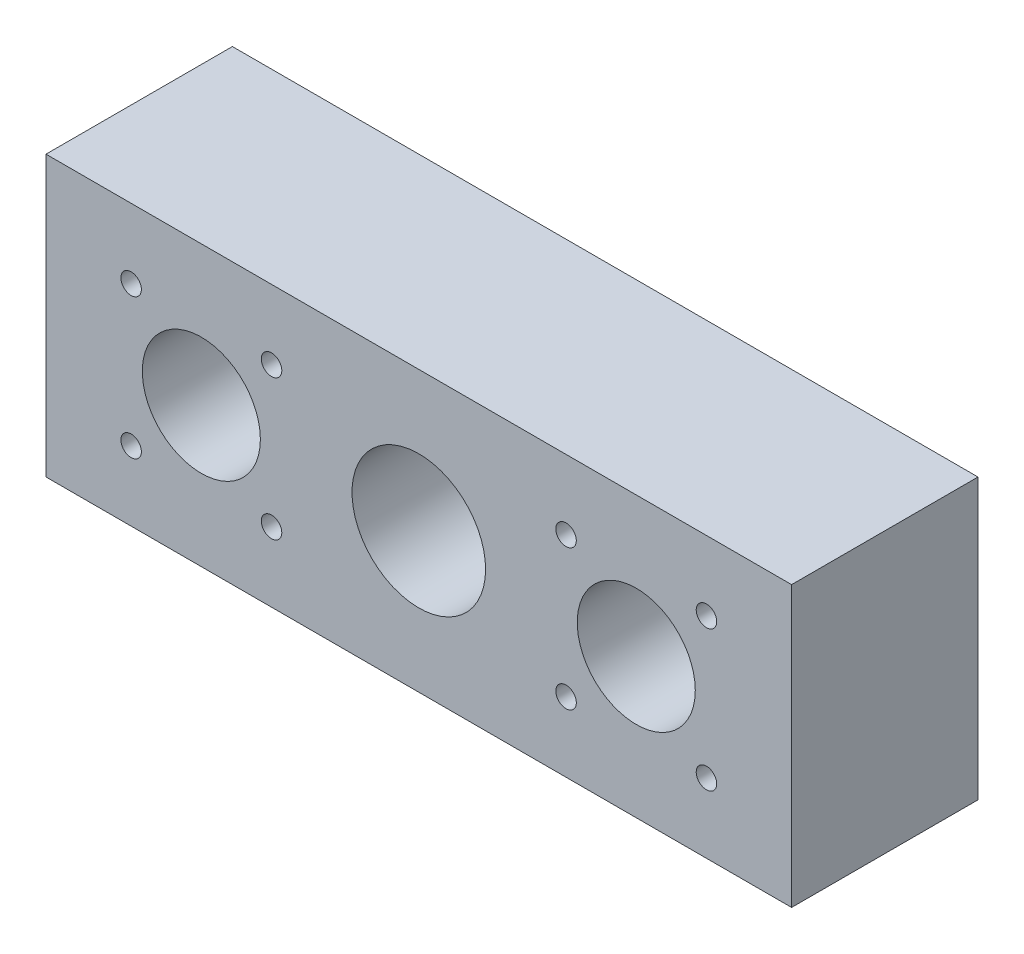
ISO-10303-21;
HEADER;
FILE_DESCRIPTION(('STEP AP214'),'2;1');
FILE_NAME('part.step','',(''),(''),'','','');
FILE_SCHEMA(('AUTOMOTIVE_DESIGN { 1 0 10303 214 1 1 1 1 }'));
ENDSEC;
DATA;
#1=APPLICATION_CONTEXT('core data for automotive mechanical design processes');
#2=APPLICATION_PROTOCOL_DEFINITION('international standard','automotive_design',2000,#1);
#3=PRODUCT_CONTEXT('',#1,'mechanical');
#4=PRODUCT('Part','Part','',(#3));
#5=PRODUCT_RELATED_PRODUCT_CATEGORY('part','',(#4));
#6=PRODUCT_DEFINITION_FORMATION('','',#4);
#7=PRODUCT_DEFINITION_CONTEXT('part definition',#1,'design');
#8=PRODUCT_DEFINITION('design','',#6,#7);
#9=PRODUCT_DEFINITION_SHAPE('','',#8);
#10=(LENGTH_UNIT() NAMED_UNIT(*) SI_UNIT(.MILLI.,.METRE.));
#11=(NAMED_UNIT(*) PLANE_ANGLE_UNIT() SI_UNIT($,.RADIAN.));
#12=(NAMED_UNIT(*) SI_UNIT($,.STERADIAN.) SOLID_ANGLE_UNIT());
#13=UNCERTAINTY_MEASURE_WITH_UNIT(LENGTH_MEASURE(1.E-05),#10,'distance_accuracy_value','');
#14=(GEOMETRIC_REPRESENTATION_CONTEXT(3) GLOBAL_UNCERTAINTY_ASSIGNED_CONTEXT((#13)) GLOBAL_UNIT_ASSIGNED_CONTEXT((#10,
#11,#12)) REPRESENTATION_CONTEXT('',''));
#15=CARTESIAN_POINT('',(0.,0.,0.));
#16=DIRECTION('',(0.,0.,1.));
#17=DIRECTION('',(1.,0.,0.));
#18=AXIS2_PLACEMENT_3D('',#15,#16,#17);
#19=CARTESIAN_POINT('',(60.,-22.5,30.));
#20=DIRECTION('',(-1.,0.,0.));
#21=DIRECTION('',(0.,0.,1.));
#22=AXIS2_PLACEMENT_3D('',#19,#20,#21);
#23=PLANE('',#22);
#24=DIRECTION('',(0.,1.,0.));
#25=VECTOR('',#24,1.);
#26=CARTESIAN_POINT('',(60.,-22.5,0.));
#27=LINE('',#26,#25);
#28=CARTESIAN_POINT('',(60.,-22.5,0.));
#29=VERTEX_POINT('',#28);
#30=CARTESIAN_POINT('',(60.,22.5,0.));
#31=VERTEX_POINT('',#30);
#32=EDGE_CURVE('E291',#29,#31,#27,.T.);
#33=ORIENTED_EDGE('',*,*,#32,.T.);
#34=DIRECTION('',(0.,0.,-1.));
#35=VECTOR('',#34,1.);
#36=CARTESIAN_POINT('',(60.,22.5,30.));
#37=LINE('',#36,#35);
#38=CARTESIAN_POINT('',(60.,22.5,30.));
#39=VERTEX_POINT('',#38);
#40=EDGE_CURVE('E11',#39,#31,#37,.T.);
#41=ORIENTED_EDGE('',*,*,#40,.F.);
#42=DIRECTION('',(0.,1.,0.));
#43=VECTOR('',#42,1.);
#44=CARTESIAN_POINT('',(60.,-22.5,30.));
#45=LINE('',#44,#43);
#46=CARTESIAN_POINT('',(60.,-22.5,30.));
#47=VERTEX_POINT('',#46);
#48=EDGE_CURVE('E294',#47,#39,#45,.T.);
#49=ORIENTED_EDGE('',*,*,#48,.F.);
#50=DIRECTION('',(0.,0.,-1.));
#51=VECTOR('',#50,1.);
#52=CARTESIAN_POINT('',(60.,-22.5,30.));
#53=LINE('',#52,#51);
#54=EDGE_CURVE('E300',#47,#29,#53,.T.);
#55=ORIENTED_EDGE('',*,*,#54,.T.);
#56=EDGE_LOOP('',(#33,#41,#49,#55));
#57=FACE_BOUND('',#56,.T.);
#58=ADVANCED_FACE('F38',(#57),#23,.F.);
#59=CARTESIAN_POINT('',(-60.,22.5,30.));
#60=DIRECTION('',(0.,-1.,0.));
#61=DIRECTION('',(0.,0.,-1.));
#62=AXIS2_PLACEMENT_3D('',#59,#60,#61);
#63=PLANE('',#62);
#64=DIRECTION('',(-1.,0.,0.));
#65=VECTOR('',#64,1.);
#66=CARTESIAN_POINT('',(-60.,22.5,0.));
#67=LINE('',#66,#65);
#68=CARTESIAN_POINT('',(-60.,22.5,0.));
#69=VERTEX_POINT('',#68);
#70=EDGE_CURVE('E303',#31,#69,#67,.T.);
#71=ORIENTED_EDGE('',*,*,#70,.T.);
#72=DIRECTION('',(0.,0.,-1.));
#73=VECTOR('',#72,1.);
#74=CARTESIAN_POINT('',(-60.,22.5,30.));
#75=LINE('',#74,#73);
#76=CARTESIAN_POINT('',(-60.,22.5,30.));
#77=VERTEX_POINT('',#76);
#78=EDGE_CURVE('E46',#77,#69,#75,.T.);
#79=ORIENTED_EDGE('',*,*,#78,.F.);
#80=DIRECTION('',(-1.,0.,0.));
#81=VECTOR('',#80,1.);
#82=CARTESIAN_POINT('',(-60.,22.5,30.));
#83=LINE('',#82,#81);
#84=EDGE_CURVE('E85',#39,#77,#83,.T.);
#85=ORIENTED_EDGE('',*,*,#84,.F.);
#86=ORIENTED_EDGE('',*,*,#40,.T.);
#87=EDGE_LOOP('',(#71,#79,#85,#86));
#88=FACE_BOUND('',#87,.T.);
#89=ADVANCED_FACE('F328',(#88),#63,.F.);
#90=CARTESIAN_POINT('',(-60.,-22.5,30.));
#91=DIRECTION('',(1.,0.,0.));
#92=DIRECTION('',(0.,0.,-1.));
#93=AXIS2_PLACEMENT_3D('',#90,#91,#92);
#94=PLANE('',#93);
#95=DIRECTION('',(0.,-1.,0.));
#96=VECTOR('',#95,1.);
#97=CARTESIAN_POINT('',(-60.,-22.5,0.));
#98=LINE('',#97,#96);
#99=CARTESIAN_POINT('',(-60.,-22.5,0.));
#100=VERTEX_POINT('',#99);
#101=EDGE_CURVE('E72',#69,#100,#98,.T.);
#102=ORIENTED_EDGE('',*,*,#101,.T.);
#103=DIRECTION('',(0.,0.,-1.));
#104=VECTOR('',#103,1.);
#105=CARTESIAN_POINT('',(-60.,-22.5,30.));
#106=LINE('',#105,#104);
#107=CARTESIAN_POINT('',(-60.,-22.5,30.));
#108=VERTEX_POINT('',#107);
#109=EDGE_CURVE('E308',#108,#100,#106,.T.);
#110=ORIENTED_EDGE('',*,*,#109,.F.);
#111=DIRECTION('',(0.,-1.,0.));
#112=VECTOR('',#111,1.);
#113=CARTESIAN_POINT('',(-60.,-22.5,30.));
#114=LINE('',#113,#112);
#115=EDGE_CURVE('E297',#77,#108,#114,.T.);
#116=ORIENTED_EDGE('',*,*,#115,.F.);
#117=ORIENTED_EDGE('',*,*,#78,.T.);
#118=EDGE_LOOP('',(#102,#110,#116,#117));
#119=FACE_BOUND('',#118,.T.);
#120=ADVANCED_FACE('F310',(#119),#94,.F.);
#121=CARTESIAN_POINT('',(-60.,-22.5,30.));
#122=DIRECTION('',(0.,1.,0.));
#123=DIRECTION('',(0.,0.,1.));
#124=AXIS2_PLACEMENT_3D('',#121,#122,#123);
#125=PLANE('',#124);
#126=CARTESIAN_POINT('',(40.6066017177982,-22.5,4.39339828220176));
#127=DIRECTION('',(0.,-1.,0.));
#128=DIRECTION('',(0.,0.,-1.));
#129=AXIS2_PLACEMENT_3D('',#126,#127,#128);
#130=CIRCLE('',#129,1.24999999999999);
#131=CARTESIAN_POINT('',(40.6066017177982,-22.5,3.14339828220177));
#132=VERTEX_POINT('',#131);
#133=EDGE_CURVE('E157',#132,#132,#130,.T.);
#134=ORIENTED_EDGE('',*,*,#133,.F.);
#135=EDGE_LOOP('',(#134));
#136=FACE_BOUND('',#135,.T.);
#137=CARTESIAN_POINT('',(19.3933982822018,-22.5,4.39339828220177));
#138=DIRECTION('',(0.,-1.,0.));
#139=DIRECTION('',(0.,0.,-1.));
#140=AXIS2_PLACEMENT_3D('',#137,#138,#139);
#141=CIRCLE('',#140,1.24999999999999);
#142=CARTESIAN_POINT('',(19.3933982822018,-22.5,3.14339828220179));
#143=VERTEX_POINT('',#142);
#144=EDGE_CURVE('E156',#143,#143,#141,.T.);
#145=ORIENTED_EDGE('',*,*,#144,.F.);
#146=EDGE_LOOP('',(#145));
#147=FACE_BOUND('',#146,.T.);
#148=CARTESIAN_POINT('',(19.3933982822018,-22.5,25.6066017177982));
#149=DIRECTION('',(0.,-1.,0.));
#150=DIRECTION('',(0.,0.,-1.));
#151=AXIS2_PLACEMENT_3D('',#148,#149,#150);
#152=CIRCLE('',#151,1.24999999999999);
#153=CARTESIAN_POINT('',(19.3933982822018,-22.5,24.3566017177982));
#154=VERTEX_POINT('',#153);
#155=EDGE_CURVE('E167',#154,#154,#152,.T.);
#156=ORIENTED_EDGE('',*,*,#155,.F.);
#157=EDGE_LOOP('',(#156));
#158=FACE_BOUND('',#157,.T.);
#159=CARTESIAN_POINT('',(40.6066017177982,-22.5,25.6066017177982));
#160=DIRECTION('',(0.,-1.,0.));
#161=DIRECTION('',(0.,0.,-1.));
#162=AXIS2_PLACEMENT_3D('',#159,#160,#161);
#163=CIRCLE('',#162,1.24999999999999);
#164=CARTESIAN_POINT('',(40.6066017177982,-22.5,24.3566017177982));
#165=VERTEX_POINT('',#164);
#166=EDGE_CURVE('E173',#165,#165,#163,.T.);
#167=ORIENTED_EDGE('',*,*,#166,.F.);
#168=EDGE_LOOP('',(#167));
#169=FACE_BOUND('',#168,.T.);
#170=CARTESIAN_POINT('',(-19.3933982822018,-22.5,4.39339828220179));
#171=DIRECTION('',(0.,-1.,0.));
#172=DIRECTION('',(0.,0.,-1.));
#173=AXIS2_PLACEMENT_3D('',#170,#171,#172);
#174=CIRCLE('',#173,1.24999999999999);
#175=CARTESIAN_POINT('',(-19.3933982822018,-22.5,3.14339828220181));
#176=VERTEX_POINT('',#175);
#177=EDGE_CURVE('E179',#176,#176,#174,.T.);
#178=ORIENTED_EDGE('',*,*,#177,.F.);
#179=EDGE_LOOP('',(#178));
#180=FACE_BOUND('',#179,.T.);
#181=CARTESIAN_POINT('',(-40.6066017177982,-22.5,4.39339828220179));
#182=DIRECTION('',(0.,-1.,0.));
#183=DIRECTION('',(0.,0.,-1.));
#184=AXIS2_PLACEMENT_3D('',#181,#182,#183);
#185=CIRCLE('',#184,1.24999999999999);
#186=CARTESIAN_POINT('',(-40.6066017177982,-22.5,3.14339828220181));
#187=VERTEX_POINT('',#186);
#188=EDGE_CURVE('E185',#187,#187,#185,.T.);
#189=ORIENTED_EDGE('',*,*,#188,.F.);
#190=EDGE_LOOP('',(#189));
#191=FACE_BOUND('',#190,.T.);
#192=CARTESIAN_POINT('',(-19.3933982822018,-22.5,25.6066017177982));
#193=DIRECTION('',(0.,-1.,0.));
#194=DIRECTION('',(0.,0.,-1.));
#195=AXIS2_PLACEMENT_3D('',#192,#193,#194);
#196=CIRCLE('',#195,1.24999999999999);
#197=CARTESIAN_POINT('',(-19.3933982822018,-22.5,24.3566017177982));
#198=VERTEX_POINT('',#197);
#199=EDGE_CURVE('E191',#198,#198,#196,.T.);
#200=ORIENTED_EDGE('',*,*,#199,.F.);
#201=EDGE_LOOP('',(#200));
#202=FACE_BOUND('',#201,.T.);
#203=CARTESIAN_POINT('',(-40.6066017177982,-22.5,25.6066017177982));
#204=DIRECTION('',(0.,-1.,0.));
#205=DIRECTION('',(0.,0.,-1.));
#206=AXIS2_PLACEMENT_3D('',#203,#204,#205);
#207=CIRCLE('',#206,1.24999999999999);
#208=CARTESIAN_POINT('',(-40.6066017177982,-22.5,24.3566017177982));
#209=VERTEX_POINT('',#208);
#210=EDGE_CURVE('E197',#209,#209,#207,.T.);
#211=ORIENTED_EDGE('',*,*,#210,.F.);
#212=EDGE_LOOP('',(#211));
#213=FACE_BOUND('',#212,.T.);
#214=DIRECTION('',(1.,0.,0.));
#215=VECTOR('',#214,1.);
#216=CARTESIAN_POINT('',(-60.,-22.5,0.));
#217=LINE('',#216,#215);
#218=EDGE_CURVE('E78',#100,#29,#217,.T.);
#219=ORIENTED_EDGE('',*,*,#218,.T.);
#220=ORIENTED_EDGE('',*,*,#54,.F.);
#221=DIRECTION('',(1.,0.,0.));
#222=VECTOR('',#221,1.);
#223=CARTESIAN_POINT('',(-60.,-22.5,30.));
#224=LINE('',#223,#222);
#225=EDGE_CURVE('E54',#108,#47,#224,.T.);
#226=ORIENTED_EDGE('',*,*,#225,.F.);
#227=ORIENTED_EDGE('',*,*,#109,.T.);
#228=EDGE_LOOP('',(#219,#220,#226,#227));
#229=FACE_BOUND('',#228,.T.);
#230=ADVANCED_FACE('F317',(#136,#147,#158,#169,#180,#191,#202,#213,#229),#125,.F.);
#231=CARTESIAN_POINT('',(0.,0.,30.));
#232=DIRECTION('',(0.,0.,-1.));
#233=DIRECTION('',(-1.,0.,0.));
#234=AXIS2_PLACEMENT_3D('',#231,#232,#233);
#235=PLANE('',#234);
#236=CARTESIAN_POINT('',(-23.7,11.3,30.));
#237=DIRECTION('',(0.,0.,1.));
#238=DIRECTION('',(1.,0.,0.));
#239=AXIS2_PLACEMENT_3D('',#236,#237,#238);
#240=CIRCLE('',#239,1.65);
#241=CARTESIAN_POINT('',(-22.05,11.3,30.));
#242=VERTEX_POINT('',#241);
#243=EDGE_CURVE('E227',#242,#242,#240,.T.);
#244=ORIENTED_EDGE('',*,*,#243,.F.);
#245=EDGE_LOOP('',(#244));
#246=FACE_BOUND('',#245,.T.);
#247=CARTESIAN_POINT('',(-46.3,-11.3,30.));
#248=DIRECTION('',(0.,0.,1.));
#249=DIRECTION('',(1.,0.,0.));
#250=AXIS2_PLACEMENT_3D('',#247,#248,#249);
#251=CIRCLE('',#250,1.65);
#252=CARTESIAN_POINT('',(-44.65,-11.3,30.));
#253=VERTEX_POINT('',#252);
#254=EDGE_CURVE('E233',#253,#253,#251,.T.);
#255=ORIENTED_EDGE('',*,*,#254,.F.);
#256=EDGE_LOOP('',(#255));
#257=FACE_BOUND('',#256,.T.);
#258=CARTESIAN_POINT('',(-46.3,11.3,30.));
#259=DIRECTION('',(0.,0.,1.));
#260=DIRECTION('',(1.,0.,0.));
#261=AXIS2_PLACEMENT_3D('',#258,#259,#260);
#262=CIRCLE('',#261,1.65);
#263=CARTESIAN_POINT('',(-44.65,11.3,30.));
#264=VERTEX_POINT('',#263);
#265=EDGE_CURVE('E239',#264,#264,#262,.T.);
#266=ORIENTED_EDGE('',*,*,#265,.F.);
#267=EDGE_LOOP('',(#266));
#268=FACE_BOUND('',#267,.T.);
#269=CARTESIAN_POINT('',(-23.7,-11.3,30.));
#270=DIRECTION('',(0.,0.,1.));
#271=DIRECTION('',(1.,0.,0.));
#272=AXIS2_PLACEMENT_3D('',#269,#270,#271);
#273=CIRCLE('',#272,1.65);
#274=CARTESIAN_POINT('',(-22.05,-11.3,30.));
#275=VERTEX_POINT('',#274);
#276=EDGE_CURVE('E245',#275,#275,#273,.T.);
#277=ORIENTED_EDGE('',*,*,#276,.F.);
#278=EDGE_LOOP('',(#277));
#279=FACE_BOUND('',#278,.T.);
#280=CARTESIAN_POINT('',(46.3,11.3,30.));
#281=DIRECTION('',(0.,0.,1.));
#282=DIRECTION('',(1.,0.,0.));
#283=AXIS2_PLACEMENT_3D('',#280,#281,#282);
#284=CIRCLE('',#283,1.65);
#285=CARTESIAN_POINT('',(47.95,11.3,30.));
#286=VERTEX_POINT('',#285);
#287=EDGE_CURVE('E251',#286,#286,#284,.T.);
#288=ORIENTED_EDGE('',*,*,#287,.F.);
#289=EDGE_LOOP('',(#288));
#290=FACE_BOUND('',#289,.T.);
#291=CARTESIAN_POINT('',(46.3,-11.3,30.));
#292=DIRECTION('',(0.,0.,1.));
#293=DIRECTION('',(1.,0.,0.));
#294=AXIS2_PLACEMENT_3D('',#291,#292,#293);
#295=CIRCLE('',#294,1.65);
#296=CARTESIAN_POINT('',(47.95,-11.3,30.));
#297=VERTEX_POINT('',#296);
#298=EDGE_CURVE('E257',#297,#297,#295,.T.);
#299=ORIENTED_EDGE('',*,*,#298,.F.);
#300=EDGE_LOOP('',(#299));
#301=FACE_BOUND('',#300,.T.);
#302=CARTESIAN_POINT('',(23.7,-11.3,30.));
#303=DIRECTION('',(0.,0.,1.));
#304=DIRECTION('',(1.,0.,0.));
#305=AXIS2_PLACEMENT_3D('',#302,#303,#304);
#306=CIRCLE('',#305,1.65);
#307=CARTESIAN_POINT('',(25.35,-11.3,30.));
#308=VERTEX_POINT('',#307);
#309=EDGE_CURVE('E263',#308,#308,#306,.T.);
#310=ORIENTED_EDGE('',*,*,#309,.F.);
#311=EDGE_LOOP('',(#310));
#312=FACE_BOUND('',#311,.T.);
#313=CARTESIAN_POINT('',(23.7,11.3,30.));
#314=DIRECTION('',(0.,0.,1.));
#315=DIRECTION('',(1.,0.,0.));
#316=AXIS2_PLACEMENT_3D('',#313,#314,#315);
#317=CIRCLE('',#316,1.65);
#318=CARTESIAN_POINT('',(25.35,11.3,30.));
#319=VERTEX_POINT('',#318);
#320=EDGE_CURVE('E269',#319,#319,#317,.T.);
#321=ORIENTED_EDGE('',*,*,#320,.F.);
#322=EDGE_LOOP('',(#321));
#323=FACE_BOUND('',#322,.T.);
#324=CARTESIAN_POINT('',(0.,0.,30.));
#325=DIRECTION('',(0.,0.,1.));
#326=DIRECTION('',(1.,0.,0.));
#327=AXIS2_PLACEMENT_3D('',#324,#325,#326);
#328=CIRCLE('',#327,10.75);
#329=CARTESIAN_POINT('',(10.75,0.,30.));
#330=VERTEX_POINT('',#329);
#331=EDGE_CURVE('E276',#330,#330,#328,.T.);
#332=ORIENTED_EDGE('',*,*,#331,.F.);
#333=EDGE_LOOP('',(#332));
#334=FACE_BOUND('',#333,.T.);
#335=CARTESIAN_POINT('',(35.,0.,30.));
#336=DIRECTION('',(0.,0.,1.));
#337=DIRECTION('',(1.,0.,0.));
#338=AXIS2_PLACEMENT_3D('',#335,#336,#337);
#339=CIRCLE('',#338,9.5);
#340=CARTESIAN_POINT('',(44.5,0.,30.));
#341=VERTEX_POINT('',#340);
#342=EDGE_CURVE('E282',#341,#341,#339,.T.);
#343=ORIENTED_EDGE('',*,*,#342,.F.);
#344=EDGE_LOOP('',(#343));
#345=FACE_BOUND('',#344,.T.);
#346=CARTESIAN_POINT('',(-35.,0.,30.));
#347=DIRECTION('',(0.,0.,1.));
#348=DIRECTION('',(1.,0.,0.));
#349=AXIS2_PLACEMENT_3D('',#346,#347,#348);
#350=CIRCLE('',#349,9.5);
#351=CARTESIAN_POINT('',(-25.5,0.,30.));
#352=VERTEX_POINT('',#351);
#353=EDGE_CURVE('E288',#352,#352,#350,.T.);
#354=ORIENTED_EDGE('',*,*,#353,.F.);
#355=EDGE_LOOP('',(#354));
#356=FACE_BOUND('',#355,.T.);
#357=ORIENTED_EDGE('',*,*,#48,.T.);
#358=ORIENTED_EDGE('',*,*,#84,.T.);
#359=ORIENTED_EDGE('',*,*,#115,.T.);
#360=ORIENTED_EDGE('',*,*,#225,.T.);
#361=EDGE_LOOP('',(#357,#358,#359,#360));
#362=FACE_BOUND('',#361,.T.);
#363=ADVANCED_FACE('F319',(#246,#257,#268,#279,#290,#301,#312,#323,#334,#345,#356,#362),#235,.F.);
#364=CARTESIAN_POINT('',(0.,0.,0.));
#365=DIRECTION('',(0.,0.,-1.));
#366=DIRECTION('',(-1.,0.,0.));
#367=AXIS2_PLACEMENT_3D('',#364,#365,#366);
#368=PLANE('',#367);
#369=CARTESIAN_POINT('',(-11.3137084989847,11.3137084989848,0.));
#370=DIRECTION('',(0.,0.,-1.));
#371=DIRECTION('',(-1.,0.,0.));
#372=AXIS2_PLACEMENT_3D('',#369,#370,#371);
#373=CIRCLE('',#372,1.64999999999999);
#374=CARTESIAN_POINT('',(-12.9637084989847,11.3137084989848,0.));
#375=VERTEX_POINT('',#374);
#376=EDGE_CURVE('E203',#375,#375,#373,.T.);
#377=ORIENTED_EDGE('',*,*,#376,.F.);
#378=EDGE_LOOP('',(#377));
#379=FACE_BOUND('',#378,.T.);
#380=CARTESIAN_POINT('',(11.3137084989848,-11.3137084989847,0.));
#381=DIRECTION('',(0.,0.,-1.));
#382=DIRECTION('',(-1.,0.,0.));
#383=AXIS2_PLACEMENT_3D('',#380,#381,#382);
#384=CIRCLE('',#383,1.64999999999999);
#385=CARTESIAN_POINT('',(9.66370849898483,-11.3137084989847,0.));
#386=VERTEX_POINT('',#385);
#387=EDGE_CURVE('E209',#386,#386,#384,.T.);
#388=ORIENTED_EDGE('',*,*,#387,.F.);
#389=EDGE_LOOP('',(#388));
#390=FACE_BOUND('',#389,.T.);
#391=CARTESIAN_POINT('',(11.3137084989848,11.3137084989847,0.));
#392=DIRECTION('',(0.,0.,-1.));
#393=DIRECTION('',(-1.,0.,0.));
#394=AXIS2_PLACEMENT_3D('',#391,#392,#393);
#395=CIRCLE('',#394,1.64999999999999);
#396=CARTESIAN_POINT('',(9.66370849898483,11.3137084989847,0.));
#397=VERTEX_POINT('',#396);
#398=EDGE_CURVE('E215',#397,#397,#395,.T.);
#399=ORIENTED_EDGE('',*,*,#398,.F.);
#400=EDGE_LOOP('',(#399));
#401=FACE_BOUND('',#400,.T.);
#402=CARTESIAN_POINT('',(-11.3137084989848,-11.3137084989847,0.));
#403=DIRECTION('',(0.,0.,-1.));
#404=DIRECTION('',(-1.,0.,0.));
#405=AXIS2_PLACEMENT_3D('',#402,#403,#404);
#406=CIRCLE('',#405,1.64999999999999);
#407=CARTESIAN_POINT('',(-12.9637084989848,-11.3137084989847,0.));
#408=VERTEX_POINT('',#407);
#409=EDGE_CURVE('E221',#408,#408,#406,.T.);
#410=ORIENTED_EDGE('',*,*,#409,.F.);
#411=EDGE_LOOP('',(#410));
#412=FACE_BOUND('',#411,.T.);
#413=CARTESIAN_POINT('',(0.,0.,0.));
#414=DIRECTION('',(0.,0.,-1.));
#415=DIRECTION('',(-1.,0.,0.));
#416=AXIS2_PLACEMENT_3D('',#413,#414,#415);
#417=CIRCLE('',#416,10.75);
#418=CARTESIAN_POINT('',(-10.75,0.,0.));
#419=VERTEX_POINT('',#418);
#420=EDGE_CURVE('E275',#419,#419,#417,.F.);
#421=ORIENTED_EDGE('',*,*,#420,.T.);
#422=EDGE_LOOP('',(#421));
#423=FACE_BOUND('',#422,.T.);
#424=CARTESIAN_POINT('',(35.,0.,0.));
#425=DIRECTION('',(0.,0.,-1.));
#426=DIRECTION('',(-1.,0.,0.));
#427=AXIS2_PLACEMENT_3D('',#424,#425,#426);
#428=CIRCLE('',#427,9.5);
#429=CARTESIAN_POINT('',(25.5,0.,0.));
#430=VERTEX_POINT('',#429);
#431=EDGE_CURVE('E279',#430,#430,#428,.F.);
#432=ORIENTED_EDGE('',*,*,#431,.T.);
#433=EDGE_LOOP('',(#432));
#434=FACE_BOUND('',#433,.T.);
#435=CARTESIAN_POINT('',(-35.,0.,0.));
#436=DIRECTION('',(0.,0.,-1.));
#437=DIRECTION('',(-1.,0.,0.));
#438=AXIS2_PLACEMENT_3D('',#435,#436,#437);
#439=CIRCLE('',#438,9.5);
#440=CARTESIAN_POINT('',(-44.5,0.,0.));
#441=VERTEX_POINT('',#440);
#442=EDGE_CURVE('E285',#441,#441,#439,.F.);
#443=ORIENTED_EDGE('',*,*,#442,.T.);
#444=EDGE_LOOP('',(#443));
#445=FACE_BOUND('',#444,.T.);
#446=ORIENTED_EDGE('',*,*,#32,.F.);
#447=ORIENTED_EDGE('',*,*,#218,.F.);
#448=ORIENTED_EDGE('',*,*,#101,.F.);
#449=ORIENTED_EDGE('',*,*,#70,.F.);
#450=EDGE_LOOP('',(#446,#447,#448,#449));
#451=FACE_BOUND('',#450,.T.);
#452=ADVANCED_FACE('F313',(#379,#390,#401,#412,#423,#434,#445,#451),#368,.T.);
#453=CARTESIAN_POINT('',(-35.,0.,-0.001000000000001));
#454=DIRECTION('',(0.,0.,1.));
#455=DIRECTION('',(1.,0.,0.));
#456=AXIS2_PLACEMENT_3D('',#453,#454,#455);
#457=CYLINDRICAL_SURFACE('',#456,9.5);
#458=ORIENTED_EDGE('',*,*,#442,.F.);
#459=EDGE_LOOP('',(#458));
#460=FACE_BOUND('',#459,.T.);
#461=ORIENTED_EDGE('',*,*,#353,.T.);
#462=EDGE_LOOP('',(#461));
#463=FACE_BOUND('',#462,.T.);
#464=ADVANCED_FACE('F349',(#460,#463),#457,.F.);
#465=CARTESIAN_POINT('',(35.,0.,-0.001000000000001));
#466=DIRECTION('',(0.,0.,1.));
#467=DIRECTION('',(1.,0.,0.));
#468=AXIS2_PLACEMENT_3D('',#465,#466,#467);
#469=CYLINDRICAL_SURFACE('',#468,9.5);
#470=ORIENTED_EDGE('',*,*,#431,.F.);
#471=EDGE_LOOP('',(#470));
#472=FACE_BOUND('',#471,.T.);
#473=ORIENTED_EDGE('',*,*,#342,.T.);
#474=EDGE_LOOP('',(#473));
#475=FACE_BOUND('',#474,.T.);
#476=ADVANCED_FACE('F354',(#472,#475),#469,.F.);
#477=CARTESIAN_POINT('',(0.,0.,-0.001000000000001));
#478=DIRECTION('',(0.,0.,1.));
#479=DIRECTION('',(1.,0.,0.));
#480=AXIS2_PLACEMENT_3D('',#477,#478,#479);
#481=CYLINDRICAL_SURFACE('',#480,10.75);
#482=ORIENTED_EDGE('',*,*,#420,.F.);
#483=EDGE_LOOP('',(#482));
#484=FACE_BOUND('',#483,.T.);
#485=ORIENTED_EDGE('',*,*,#331,.T.);
#486=EDGE_LOOP('',(#485));
#487=FACE_BOUND('',#486,.T.);
#488=ADVANCED_FACE('F366',(#484,#487),#481,.F.);
#489=CARTESIAN_POINT('',(23.7,11.3,19.9));
#490=DIRECTION('',(0.,0.,1.));
#491=DIRECTION('',(1.,0.,0.));
#492=AXIS2_PLACEMENT_3D('',#489,#490,#491);
#493=CONICAL_SURFACE('',#492,1.65,1.02974425867665);
#494=CARTESIAN_POINT('',(23.7,11.3,18.9085799786045));
#495=VERTEX_POINT('',#494);
#496=VERTEX_LOOP('',#495);
#497=FACE_BOUND('',#496,.T.);
#498=CARTESIAN_POINT('',(23.7,11.3,19.9));
#499=DIRECTION('',(0.,0.,1.));
#500=DIRECTION('',(1.,0.,0.));
#501=AXIS2_PLACEMENT_3D('',#498,#499,#500);
#502=CIRCLE('',#501,1.65);
#503=CARTESIAN_POINT('',(25.35,11.3,19.9));
#504=VERTEX_POINT('',#503);
#505=EDGE_CURVE('E272',#504,#504,#502,.T.);
#506=ORIENTED_EDGE('',*,*,#505,.T.);
#507=EDGE_LOOP('',(#506));
#508=FACE_BOUND('',#507,.T.);
#509=ADVANCED_FACE('F376',(#497,#508),#493,.F.);
#510=CARTESIAN_POINT('',(23.7,11.3,30.));
#511=DIRECTION('',(0.,0.,1.));
#512=DIRECTION('',(1.,0.,0.));
#513=AXIS2_PLACEMENT_3D('',#510,#511,#512);
#514=CYLINDRICAL_SURFACE('',#513,1.65);
#515=ORIENTED_EDGE('',*,*,#505,.F.);
#516=EDGE_LOOP('',(#515));
#517=FACE_BOUND('',#516,.T.);
#518=ORIENTED_EDGE('',*,*,#320,.T.);
#519=EDGE_LOOP('',(#518));
#520=FACE_BOUND('',#519,.T.);
#521=ADVANCED_FACE('F392',(#517,#520),#514,.F.);
#522=CARTESIAN_POINT('',(23.7,-11.3,19.9));
#523=DIRECTION('',(0.,0.,1.));
#524=DIRECTION('',(1.,0.,0.));
#525=AXIS2_PLACEMENT_3D('',#522,#523,#524);
#526=CONICAL_SURFACE('',#525,1.65,1.02974425867665);
#527=CARTESIAN_POINT('',(23.7,-11.3,18.9085799786045));
#528=VERTEX_POINT('',#527);
#529=VERTEX_LOOP('',#528);
#530=FACE_BOUND('',#529,.T.);
#531=CARTESIAN_POINT('',(23.7,-11.3,19.9));
#532=DIRECTION('',(0.,0.,1.));
#533=DIRECTION('',(1.,0.,0.));
#534=AXIS2_PLACEMENT_3D('',#531,#532,#533);
#535=CIRCLE('',#534,1.65);
#536=CARTESIAN_POINT('',(25.35,-11.3,19.9));
#537=VERTEX_POINT('',#536);
#538=EDGE_CURVE('E266',#537,#537,#535,.T.);
#539=ORIENTED_EDGE('',*,*,#538,.T.);
#540=EDGE_LOOP('',(#539));
#541=FACE_BOUND('',#540,.T.);
#542=ADVANCED_FACE('F403',(#530,#541),#526,.F.);
#543=CARTESIAN_POINT('',(23.7,-11.3,30.));
#544=DIRECTION('',(0.,0.,1.));
#545=DIRECTION('',(1.,0.,0.));
#546=AXIS2_PLACEMENT_3D('',#543,#544,#545);
#547=CYLINDRICAL_SURFACE('',#546,1.65);
#548=ORIENTED_EDGE('',*,*,#538,.F.);
#549=EDGE_LOOP('',(#548));
#550=FACE_BOUND('',#549,.T.);
#551=ORIENTED_EDGE('',*,*,#309,.T.);
#552=EDGE_LOOP('',(#551));
#553=FACE_BOUND('',#552,.T.);
#554=ADVANCED_FACE('F416',(#550,#553),#547,.F.);
#555=CARTESIAN_POINT('',(46.3,-11.3,19.9));
#556=DIRECTION('',(0.,0.,1.));
#557=DIRECTION('',(1.,0.,0.));
#558=AXIS2_PLACEMENT_3D('',#555,#556,#557);
#559=CONICAL_SURFACE('',#558,1.65,1.02974425867665);
#560=CARTESIAN_POINT('',(46.3,-11.3,18.9085799786045));
#561=VERTEX_POINT('',#560);
#562=VERTEX_LOOP('',#561);
#563=FACE_BOUND('',#562,.T.);
#564=CARTESIAN_POINT('',(46.3,-11.3,19.9));
#565=DIRECTION('',(0.,0.,1.));
#566=DIRECTION('',(1.,0.,0.));
#567=AXIS2_PLACEMENT_3D('',#564,#565,#566);
#568=CIRCLE('',#567,1.65);
#569=CARTESIAN_POINT('',(47.95,-11.3,19.9));
#570=VERTEX_POINT('',#569);
#571=EDGE_CURVE('E260',#570,#570,#568,.T.);
#572=ORIENTED_EDGE('',*,*,#571,.T.);
#573=EDGE_LOOP('',(#572));
#574=FACE_BOUND('',#573,.T.);
#575=ADVANCED_FACE('F426',(#563,#574),#559,.F.);
#576=CARTESIAN_POINT('',(46.3,-11.3,30.));
#577=DIRECTION('',(0.,0.,1.));
#578=DIRECTION('',(1.,0.,0.));
#579=AXIS2_PLACEMENT_3D('',#576,#577,#578);
#580=CYLINDRICAL_SURFACE('',#579,1.65);
#581=ORIENTED_EDGE('',*,*,#571,.F.);
#582=EDGE_LOOP('',(#581));
#583=FACE_BOUND('',#582,.T.);
#584=ORIENTED_EDGE('',*,*,#298,.T.);
#585=EDGE_LOOP('',(#584));
#586=FACE_BOUND('',#585,.T.);
#587=ADVANCED_FACE('F438',(#583,#586),#580,.F.);
#588=CARTESIAN_POINT('',(46.3,11.3,19.9));
#589=DIRECTION('',(0.,0.,1.));
#590=DIRECTION('',(1.,0.,0.));
#591=AXIS2_PLACEMENT_3D('',#588,#589,#590);
#592=CONICAL_SURFACE('',#591,1.65,1.02974425867665);
#593=CARTESIAN_POINT('',(46.3,11.3,18.9085799786045));
#594=VERTEX_POINT('',#593);
#595=VERTEX_LOOP('',#594);
#596=FACE_BOUND('',#595,.T.);
#597=CARTESIAN_POINT('',(46.3,11.3,19.9));
#598=DIRECTION('',(0.,0.,1.));
#599=DIRECTION('',(1.,0.,0.));
#600=AXIS2_PLACEMENT_3D('',#597,#598,#599);
#601=CIRCLE('',#600,1.65);
#602=CARTESIAN_POINT('',(47.95,11.3,19.9));
#603=VERTEX_POINT('',#602);
#604=EDGE_CURVE('E254',#603,#603,#601,.T.);
#605=ORIENTED_EDGE('',*,*,#604,.T.);
#606=EDGE_LOOP('',(#605));
#607=FACE_BOUND('',#606,.T.);
#608=ADVANCED_FACE('F448',(#596,#607),#592,.F.);
#609=CARTESIAN_POINT('',(46.3,11.3,30.));
#610=DIRECTION('',(0.,0.,1.));
#611=DIRECTION('',(1.,0.,0.));
#612=AXIS2_PLACEMENT_3D('',#609,#610,#611);
#613=CYLINDRICAL_SURFACE('',#612,1.65);
#614=ORIENTED_EDGE('',*,*,#604,.F.);
#615=EDGE_LOOP('',(#614));
#616=FACE_BOUND('',#615,.T.);
#617=ORIENTED_EDGE('',*,*,#287,.T.);
#618=EDGE_LOOP('',(#617));
#619=FACE_BOUND('',#618,.T.);
#620=ADVANCED_FACE('F460',(#616,#619),#613,.F.);
#621=CARTESIAN_POINT('',(-23.7,-11.3,19.9));
#622=DIRECTION('',(0.,0.,1.));
#623=DIRECTION('',(1.,0.,0.));
#624=AXIS2_PLACEMENT_3D('',#621,#622,#623);
#625=CONICAL_SURFACE('',#624,1.65,1.02974425867665);
#626=CARTESIAN_POINT('',(-23.7,-11.3,18.9085799786045));
#627=VERTEX_POINT('',#626);
#628=VERTEX_LOOP('',#627);
#629=FACE_BOUND('',#628,.T.);
#630=CARTESIAN_POINT('',(-23.7,-11.3,19.9));
#631=DIRECTION('',(0.,0.,1.));
#632=DIRECTION('',(1.,0.,0.));
#633=AXIS2_PLACEMENT_3D('',#630,#631,#632);
#634=CIRCLE('',#633,1.65);
#635=CARTESIAN_POINT('',(-22.05,-11.3,19.9));
#636=VERTEX_POINT('',#635);
#637=EDGE_CURVE('E248',#636,#636,#634,.T.);
#638=ORIENTED_EDGE('',*,*,#637,.T.);
#639=EDGE_LOOP('',(#638));
#640=FACE_BOUND('',#639,.T.);
#641=ADVANCED_FACE('F470',(#629,#640),#625,.F.);
#642=CARTESIAN_POINT('',(-23.7,-11.3,30.));
#643=DIRECTION('',(0.,0.,1.));
#644=DIRECTION('',(1.,0.,0.));
#645=AXIS2_PLACEMENT_3D('',#642,#643,#644);
#646=CYLINDRICAL_SURFACE('',#645,1.65);
#647=ORIENTED_EDGE('',*,*,#637,.F.);
#648=EDGE_LOOP('',(#647));
#649=FACE_BOUND('',#648,.T.);
#650=ORIENTED_EDGE('',*,*,#276,.T.);
#651=EDGE_LOOP('',(#650));
#652=FACE_BOUND('',#651,.T.);
#653=ADVANCED_FACE('F482',(#649,#652),#646,.F.);
#654=CARTESIAN_POINT('',(-46.3,11.3,19.9));
#655=DIRECTION('',(0.,0.,1.));
#656=DIRECTION('',(1.,0.,0.));
#657=AXIS2_PLACEMENT_3D('',#654,#655,#656);
#658=CONICAL_SURFACE('',#657,1.65,1.02974425867665);
#659=CARTESIAN_POINT('',(-46.3,11.3,18.9085799786045));
#660=VERTEX_POINT('',#659);
#661=VERTEX_LOOP('',#660);
#662=FACE_BOUND('',#661,.T.);
#663=CARTESIAN_POINT('',(-46.3,11.3,19.9));
#664=DIRECTION('',(0.,0.,1.));
#665=DIRECTION('',(1.,0.,0.));
#666=AXIS2_PLACEMENT_3D('',#663,#664,#665);
#667=CIRCLE('',#666,1.65);
#668=CARTESIAN_POINT('',(-44.65,11.3,19.9));
#669=VERTEX_POINT('',#668);
#670=EDGE_CURVE('E242',#669,#669,#667,.T.);
#671=ORIENTED_EDGE('',*,*,#670,.T.);
#672=EDGE_LOOP('',(#671));
#673=FACE_BOUND('',#672,.T.);
#674=ADVANCED_FACE('F492',(#662,#673),#658,.F.);
#675=CARTESIAN_POINT('',(-46.3,11.3,30.));
#676=DIRECTION('',(0.,0.,1.));
#677=DIRECTION('',(1.,0.,0.));
#678=AXIS2_PLACEMENT_3D('',#675,#676,#677);
#679=CYLINDRICAL_SURFACE('',#678,1.65);
#680=ORIENTED_EDGE('',*,*,#670,.F.);
#681=EDGE_LOOP('',(#680));
#682=FACE_BOUND('',#681,.T.);
#683=ORIENTED_EDGE('',*,*,#265,.T.);
#684=EDGE_LOOP('',(#683));
#685=FACE_BOUND('',#684,.T.);
#686=ADVANCED_FACE('F504',(#682,#685),#679,.F.);
#687=CARTESIAN_POINT('',(-46.3,-11.3,19.9));
#688=DIRECTION('',(0.,0.,1.));
#689=DIRECTION('',(1.,0.,0.));
#690=AXIS2_PLACEMENT_3D('',#687,#688,#689);
#691=CONICAL_SURFACE('',#690,1.65,1.02974425867665);
#692=CARTESIAN_POINT('',(-46.3,-11.3,18.9085799786045));
#693=VERTEX_POINT('',#692);
#694=VERTEX_LOOP('',#693);
#695=FACE_BOUND('',#694,.T.);
#696=CARTESIAN_POINT('',(-46.3,-11.3,19.9));
#697=DIRECTION('',(0.,0.,1.));
#698=DIRECTION('',(1.,0.,0.));
#699=AXIS2_PLACEMENT_3D('',#696,#697,#698);
#700=CIRCLE('',#699,1.65);
#701=CARTESIAN_POINT('',(-44.65,-11.3,19.9));
#702=VERTEX_POINT('',#701);
#703=EDGE_CURVE('E236',#702,#702,#700,.T.);
#704=ORIENTED_EDGE('',*,*,#703,.T.);
#705=EDGE_LOOP('',(#704));
#706=FACE_BOUND('',#705,.T.);
#707=ADVANCED_FACE('F514',(#695,#706),#691,.F.);
#708=CARTESIAN_POINT('',(-46.3,-11.3,30.));
#709=DIRECTION('',(0.,0.,1.));
#710=DIRECTION('',(1.,0.,0.));
#711=AXIS2_PLACEMENT_3D('',#708,#709,#710);
#712=CYLINDRICAL_SURFACE('',#711,1.65);
#713=ORIENTED_EDGE('',*,*,#703,.F.);
#714=EDGE_LOOP('',(#713));
#715=FACE_BOUND('',#714,.T.);
#716=ORIENTED_EDGE('',*,*,#254,.T.);
#717=EDGE_LOOP('',(#716));
#718=FACE_BOUND('',#717,.T.);
#719=ADVANCED_FACE('F526',(#715,#718),#712,.F.);
#720=CARTESIAN_POINT('',(-23.7,11.3,19.9));
#721=DIRECTION('',(0.,0.,1.));
#722=DIRECTION('',(1.,0.,0.));
#723=AXIS2_PLACEMENT_3D('',#720,#721,#722);
#724=CONICAL_SURFACE('',#723,1.65,1.02974425867665);
#725=CARTESIAN_POINT('',(-23.7,11.3,18.9085799786045));
#726=VERTEX_POINT('',#725);
#727=VERTEX_LOOP('',#726);
#728=FACE_BOUND('',#727,.T.);
#729=CARTESIAN_POINT('',(-23.7,11.3,19.9));
#730=DIRECTION('',(0.,0.,1.));
#731=DIRECTION('',(1.,0.,0.));
#732=AXIS2_PLACEMENT_3D('',#729,#730,#731);
#733=CIRCLE('',#732,1.65);
#734=CARTESIAN_POINT('',(-22.05,11.3,19.9));
#735=VERTEX_POINT('',#734);
#736=EDGE_CURVE('E230',#735,#735,#733,.T.);
#737=ORIENTED_EDGE('',*,*,#736,.T.);
#738=EDGE_LOOP('',(#737));
#739=FACE_BOUND('',#738,.T.);
#740=ADVANCED_FACE('F536',(#728,#739),#724,.F.);
#741=CARTESIAN_POINT('',(-23.7,11.3,30.));
#742=DIRECTION('',(0.,0.,1.));
#743=DIRECTION('',(1.,0.,0.));
#744=AXIS2_PLACEMENT_3D('',#741,#742,#743);
#745=CYLINDRICAL_SURFACE('',#744,1.65);
#746=ORIENTED_EDGE('',*,*,#736,.F.);
#747=EDGE_LOOP('',(#746));
#748=FACE_BOUND('',#747,.T.);
#749=ORIENTED_EDGE('',*,*,#243,.T.);
#750=EDGE_LOOP('',(#749));
#751=FACE_BOUND('',#750,.T.);
#752=ADVANCED_FACE('F548',(#748,#751),#745,.F.);
#753=CARTESIAN_POINT('',(-11.3137084989848,-11.3137084989847,10.1));
#754=DIRECTION('',(0.,0.,-1.));
#755=DIRECTION('',(-1.,0.,0.));
#756=AXIS2_PLACEMENT_3D('',#753,#754,#755);
#757=CONICAL_SURFACE('',#756,1.64999999999999,1.02974425867665);
#758=CARTESIAN_POINT('',(-11.3137084989848,-11.3137084989847,11.0914200213955));
#759=VERTEX_POINT('',#758);
#760=VERTEX_LOOP('',#759);
#761=FACE_BOUND('',#760,.T.);
#762=CARTESIAN_POINT('',(-11.3137084989848,-11.3137084989847,10.1));
#763=DIRECTION('',(0.,0.,-1.));
#764=DIRECTION('',(-1.,0.,0.));
#765=AXIS2_PLACEMENT_3D('',#762,#763,#764);
#766=CIRCLE('',#765,1.64999999999999);
#767=CARTESIAN_POINT('',(-12.9637084989848,-11.3137084989847,10.1));
#768=VERTEX_POINT('',#767);
#769=EDGE_CURVE('E224',#768,#768,#766,.T.);
#770=ORIENTED_EDGE('',*,*,#769,.T.);
#771=EDGE_LOOP('',(#770));
#772=FACE_BOUND('',#771,.T.);
#773=ADVANCED_FACE('F558',(#761,#772),#757,.F.);
#774=CARTESIAN_POINT('',(-11.3137084989848,-11.3137084989847,0.));
#775=DIRECTION('',(0.,0.,-1.));
#776=DIRECTION('',(-1.,0.,0.));
#777=AXIS2_PLACEMENT_3D('',#774,#775,#776);
#778=CYLINDRICAL_SURFACE('',#777,1.64999999999999);
#779=ORIENTED_EDGE('',*,*,#769,.F.);
#780=EDGE_LOOP('',(#779));
#781=FACE_BOUND('',#780,.T.);
#782=ORIENTED_EDGE('',*,*,#409,.T.);
#783=EDGE_LOOP('',(#782));
#784=FACE_BOUND('',#783,.T.);
#785=ADVANCED_FACE('F575',(#781,#784),#778,.F.);
#786=CARTESIAN_POINT('',(11.3137084989848,11.3137084989847,10.1));
#787=DIRECTION('',(0.,0.,-1.));
#788=DIRECTION('',(-1.,0.,0.));
#789=AXIS2_PLACEMENT_3D('',#786,#787,#788);
#790=CONICAL_SURFACE('',#789,1.64999999999999,1.02974425867665);
#791=CARTESIAN_POINT('',(11.3137084989848,11.3137084989847,11.0914200213955));
#792=VERTEX_POINT('',#791);
#793=VERTEX_LOOP('',#792);
#794=FACE_BOUND('',#793,.T.);
#795=CARTESIAN_POINT('',(11.3137084989848,11.3137084989847,10.1));
#796=DIRECTION('',(0.,0.,-1.));
#797=DIRECTION('',(-1.,0.,0.));
#798=AXIS2_PLACEMENT_3D('',#795,#796,#797);
#799=CIRCLE('',#798,1.64999999999999);
#800=CARTESIAN_POINT('',(9.66370849898483,11.3137084989847,10.1));
#801=VERTEX_POINT('',#800);
#802=EDGE_CURVE('E218',#801,#801,#799,.T.);
#803=ORIENTED_EDGE('',*,*,#802,.T.);
#804=EDGE_LOOP('',(#803));
#805=FACE_BOUND('',#804,.T.);
#806=ADVANCED_FACE('F586',(#794,#805),#790,.F.);
#807=CARTESIAN_POINT('',(11.3137084989848,11.3137084989847,0.));
#808=DIRECTION('',(0.,0.,-1.));
#809=DIRECTION('',(-1.,0.,0.));
#810=AXIS2_PLACEMENT_3D('',#807,#808,#809);
#811=CYLINDRICAL_SURFACE('',#810,1.64999999999999);
#812=ORIENTED_EDGE('',*,*,#802,.F.);
#813=EDGE_LOOP('',(#812));
#814=FACE_BOUND('',#813,.T.);
#815=ORIENTED_EDGE('',*,*,#398,.T.);
#816=EDGE_LOOP('',(#815));
#817=FACE_BOUND('',#816,.T.);
#818=ADVANCED_FACE('F599',(#814,#817),#811,.F.);
#819=CARTESIAN_POINT('',(11.3137084989848,-11.3137084989847,10.1));
#820=DIRECTION('',(0.,0.,-1.));
#821=DIRECTION('',(-1.,0.,0.));
#822=AXIS2_PLACEMENT_3D('',#819,#820,#821);
#823=CONICAL_SURFACE('',#822,1.64999999999999,1.02974425867665);
#824=CARTESIAN_POINT('',(11.3137084989848,-11.3137084989847,11.0914200213955));
#825=VERTEX_POINT('',#824);
#826=VERTEX_LOOP('',#825);
#827=FACE_BOUND('',#826,.T.);
#828=CARTESIAN_POINT('',(11.3137084989848,-11.3137084989847,10.1));
#829=DIRECTION('',(0.,0.,-1.));
#830=DIRECTION('',(-1.,0.,0.));
#831=AXIS2_PLACEMENT_3D('',#828,#829,#830);
#832=CIRCLE('',#831,1.64999999999999);
#833=CARTESIAN_POINT('',(9.66370849898483,-11.3137084989847,10.1));
#834=VERTEX_POINT('',#833);
#835=EDGE_CURVE('E212',#834,#834,#832,.T.);
#836=ORIENTED_EDGE('',*,*,#835,.T.);
#837=EDGE_LOOP('',(#836));
#838=FACE_BOUND('',#837,.T.);
#839=ADVANCED_FACE('F609',(#827,#838),#823,.F.);
#840=CARTESIAN_POINT('',(11.3137084989848,-11.3137084989847,0.));
#841=DIRECTION('',(0.,0.,-1.));
#842=DIRECTION('',(-1.,0.,0.));
#843=AXIS2_PLACEMENT_3D('',#840,#841,#842);
#844=CYLINDRICAL_SURFACE('',#843,1.64999999999999);
#845=ORIENTED_EDGE('',*,*,#835,.F.);
#846=EDGE_LOOP('',(#845));
#847=FACE_BOUND('',#846,.T.);
#848=ORIENTED_EDGE('',*,*,#387,.T.);
#849=EDGE_LOOP('',(#848));
#850=FACE_BOUND('',#849,.T.);
#851=ADVANCED_FACE('F621',(#847,#850),#844,.F.);
#852=CARTESIAN_POINT('',(-11.3137084989847,11.3137084989848,10.1));
#853=DIRECTION('',(0.,0.,-1.));
#854=DIRECTION('',(-1.,0.,0.));
#855=AXIS2_PLACEMENT_3D('',#852,#853,#854);
#856=CONICAL_SURFACE('',#855,1.64999999999999,1.02974425867665);
#857=CARTESIAN_POINT('',(-11.3137084989847,11.3137084989848,11.0914200213955));
#858=VERTEX_POINT('',#857);
#859=VERTEX_LOOP('',#858);
#860=FACE_BOUND('',#859,.T.);
#861=CARTESIAN_POINT('',(-11.3137084989847,11.3137084989848,10.1));
#862=DIRECTION('',(0.,0.,-1.));
#863=DIRECTION('',(-1.,0.,0.));
#864=AXIS2_PLACEMENT_3D('',#861,#862,#863);
#865=CIRCLE('',#864,1.64999999999999);
#866=CARTESIAN_POINT('',(-12.9637084989847,11.3137084989848,10.1));
#867=VERTEX_POINT('',#866);
#868=EDGE_CURVE('E206',#867,#867,#865,.T.);
#869=ORIENTED_EDGE('',*,*,#868,.T.);
#870=EDGE_LOOP('',(#869));
#871=FACE_BOUND('',#870,.T.);
#872=ADVANCED_FACE('F631',(#860,#871),#856,.F.);
#873=CARTESIAN_POINT('',(-11.3137084989847,11.3137084989848,0.));
#874=DIRECTION('',(0.,0.,-1.));
#875=DIRECTION('',(-1.,0.,0.));
#876=AXIS2_PLACEMENT_3D('',#873,#874,#875);
#877=CYLINDRICAL_SURFACE('',#876,1.64999999999999);
#878=ORIENTED_EDGE('',*,*,#868,.F.);
#879=EDGE_LOOP('',(#878));
#880=FACE_BOUND('',#879,.T.);
#881=ORIENTED_EDGE('',*,*,#376,.T.);
#882=EDGE_LOOP('',(#881));
#883=FACE_BOUND('',#882,.T.);
#884=ADVANCED_FACE('F642',(#880,#883),#877,.F.);
#885=CARTESIAN_POINT('',(-40.6066017177982,-15.,25.6066017177982));
#886=DIRECTION('',(0.,-1.,0.));
#887=DIRECTION('',(0.,0.,-1.));
#888=AXIS2_PLACEMENT_3D('',#885,#886,#887);
#889=CONICAL_SURFACE('',#888,1.24999999999999,1.02974425867665);
#890=CARTESIAN_POINT('',(-40.6066017177982,-14.2489242262155,25.6066017177982));
#891=VERTEX_POINT('',#890);
#892=VERTEX_LOOP('',#891);
#893=FACE_BOUND('',#892,.T.);
#894=CARTESIAN_POINT('',(-40.6066017177982,-15.,25.6066017177982));
#895=DIRECTION('',(0.,-1.,0.));
#896=DIRECTION('',(0.,0.,-1.));
#897=AXIS2_PLACEMENT_3D('',#894,#895,#896);
#898=CIRCLE('',#897,1.24999999999999);
#899=CARTESIAN_POINT('',(-40.6066017177982,-15.,24.3566017177982));
#900=VERTEX_POINT('',#899);
#901=EDGE_CURVE('E200',#900,#900,#898,.T.);
#902=ORIENTED_EDGE('',*,*,#901,.T.);
#903=EDGE_LOOP('',(#902));
#904=FACE_BOUND('',#903,.T.);
#905=ADVANCED_FACE('F651',(#893,#904),#889,.F.);
#906=CARTESIAN_POINT('',(-40.6066017177982,-22.5,25.6066017177982));
#907=DIRECTION('',(0.,-1.,0.));
#908=DIRECTION('',(0.,0.,-1.));
#909=AXIS2_PLACEMENT_3D('',#906,#907,#908);
#910=CYLINDRICAL_SURFACE('',#909,1.24999999999999);
#911=ORIENTED_EDGE('',*,*,#901,.F.);
#912=EDGE_LOOP('',(#911));
#913=FACE_BOUND('',#912,.T.);
#914=ORIENTED_EDGE('',*,*,#210,.T.);
#915=EDGE_LOOP('',(#914));
#916=FACE_BOUND('',#915,.T.);
#917=ADVANCED_FACE('F666',(#913,#916),#910,.F.);
#918=CARTESIAN_POINT('',(-19.3933982822018,-15.,25.6066017177982));
#919=DIRECTION('',(0.,-1.,0.));
#920=DIRECTION('',(0.,0.,-1.));
#921=AXIS2_PLACEMENT_3D('',#918,#919,#920);
#922=CONICAL_SURFACE('',#921,1.24999999999999,1.02974425867665);
#923=CARTESIAN_POINT('',(-19.3933982822018,-14.2489242262155,25.6066017177982));
#924=VERTEX_POINT('',#923);
#925=VERTEX_LOOP('',#924);
#926=FACE_BOUND('',#925,.T.);
#927=CARTESIAN_POINT('',(-19.3933982822018,-15.,25.6066017177982));
#928=DIRECTION('',(0.,-1.,0.));
#929=DIRECTION('',(0.,0.,-1.));
#930=AXIS2_PLACEMENT_3D('',#927,#928,#929);
#931=CIRCLE('',#930,1.24999999999999);
#932=CARTESIAN_POINT('',(-19.3933982822018,-15.,24.3566017177982));
#933=VERTEX_POINT('',#932);
#934=EDGE_CURVE('E194',#933,#933,#931,.T.);
#935=ORIENTED_EDGE('',*,*,#934,.T.);
#936=EDGE_LOOP('',(#935));
#937=FACE_BOUND('',#936,.T.);
#938=ADVANCED_FACE('F676',(#926,#937),#922,.F.);
#939=CARTESIAN_POINT('',(-19.3933982822018,-22.5,25.6066017177982));
#940=DIRECTION('',(0.,-1.,0.));
#941=DIRECTION('',(0.,0.,-1.));
#942=AXIS2_PLACEMENT_3D('',#939,#940,#941);
#943=CYLINDRICAL_SURFACE('',#942,1.24999999999999);
#944=ORIENTED_EDGE('',*,*,#934,.F.);
#945=EDGE_LOOP('',(#944));
#946=FACE_BOUND('',#945,.T.);
#947=ORIENTED_EDGE('',*,*,#199,.T.);
#948=EDGE_LOOP('',(#947));
#949=FACE_BOUND('',#948,.T.);
#950=ADVANCED_FACE('F688',(#946,#949),#943,.F.);
#951=CARTESIAN_POINT('',(-40.6066017177982,-15.,4.39339828220179));
#952=DIRECTION('',(0.,-1.,0.));
#953=DIRECTION('',(0.,0.,-1.));
#954=AXIS2_PLACEMENT_3D('',#951,#952,#953);
#955=CONICAL_SURFACE('',#954,1.24999999999999,1.02974425867665);
#956=CARTESIAN_POINT('',(-40.6066017177982,-14.2489242262155,4.39339828220179));
#957=VERTEX_POINT('',#956);
#958=VERTEX_LOOP('',#957);
#959=FACE_BOUND('',#958,.T.);
#960=CARTESIAN_POINT('',(-40.6066017177982,-15.,4.39339828220179));
#961=DIRECTION('',(0.,-1.,0.));
#962=DIRECTION('',(0.,0.,-1.));
#963=AXIS2_PLACEMENT_3D('',#960,#961,#962);
#964=CIRCLE('',#963,1.24999999999999);
#965=CARTESIAN_POINT('',(-40.6066017177982,-15.,3.14339828220181));
#966=VERTEX_POINT('',#965);
#967=EDGE_CURVE('E188',#966,#966,#964,.T.);
#968=ORIENTED_EDGE('',*,*,#967,.T.);
#969=EDGE_LOOP('',(#968));
#970=FACE_BOUND('',#969,.T.);
#971=ADVANCED_FACE('F698',(#959,#970),#955,.F.);
#972=CARTESIAN_POINT('',(-40.6066017177982,-22.5,4.39339828220179));
#973=DIRECTION('',(0.,-1.,0.));
#974=DIRECTION('',(0.,0.,-1.));
#975=AXIS2_PLACEMENT_3D('',#972,#973,#974);
#976=CYLINDRICAL_SURFACE('',#975,1.24999999999999);
#977=ORIENTED_EDGE('',*,*,#967,.F.);
#978=EDGE_LOOP('',(#977));
#979=FACE_BOUND('',#978,.T.);
#980=ORIENTED_EDGE('',*,*,#188,.T.);
#981=EDGE_LOOP('',(#980));
#982=FACE_BOUND('',#981,.T.);
#983=ADVANCED_FACE('F710',(#979,#982),#976,.F.);
#984=CARTESIAN_POINT('',(-19.3933982822018,-15.,4.39339828220179));
#985=DIRECTION('',(0.,-1.,0.));
#986=DIRECTION('',(0.,0.,-1.));
#987=AXIS2_PLACEMENT_3D('',#984,#985,#986);
#988=CONICAL_SURFACE('',#987,1.24999999999999,1.02974425867665);
#989=CARTESIAN_POINT('',(-19.3933982822018,-14.2489242262155,4.39339828220179));
#990=VERTEX_POINT('',#989);
#991=VERTEX_LOOP('',#990);
#992=FACE_BOUND('',#991,.T.);
#993=CARTESIAN_POINT('',(-19.3933982822018,-15.,4.39339828220179));
#994=DIRECTION('',(0.,-1.,0.));
#995=DIRECTION('',(0.,0.,-1.));
#996=AXIS2_PLACEMENT_3D('',#993,#994,#995);
#997=CIRCLE('',#996,1.24999999999999);
#998=CARTESIAN_POINT('',(-19.3933982822018,-15.,3.14339828220181));
#999=VERTEX_POINT('',#998);
#1000=EDGE_CURVE('E182',#999,#999,#997,.T.);
#1001=ORIENTED_EDGE('',*,*,#1000,.T.);
#1002=EDGE_LOOP('',(#1001));
#1003=FACE_BOUND('',#1002,.T.);
#1004=ADVANCED_FACE('F720',(#992,#1003),#988,.F.);
#1005=CARTESIAN_POINT('',(-19.3933982822018,-22.5,4.39339828220179));
#1006=DIRECTION('',(0.,-1.,0.));
#1007=DIRECTION('',(0.,0.,-1.));
#1008=AXIS2_PLACEMENT_3D('',#1005,#1006,#1007);
#1009=CYLINDRICAL_SURFACE('',#1008,1.24999999999999);
#1010=ORIENTED_EDGE('',*,*,#1000,.F.);
#1011=EDGE_LOOP('',(#1010));
#1012=FACE_BOUND('',#1011,.T.);
#1013=ORIENTED_EDGE('',*,*,#177,.T.);
#1014=EDGE_LOOP('',(#1013));
#1015=FACE_BOUND('',#1014,.T.);
#1016=ADVANCED_FACE('F732',(#1012,#1015),#1009,.F.);
#1017=CARTESIAN_POINT('',(40.6066017177982,-15.,25.6066017177982));
#1018=DIRECTION('',(0.,-1.,0.));
#1019=DIRECTION('',(0.,0.,-1.));
#1020=AXIS2_PLACEMENT_3D('',#1017,#1018,#1019);
#1021=CONICAL_SURFACE('',#1020,1.24999999999999,1.02974425867665);
#1022=CARTESIAN_POINT('',(40.6066017177982,-14.2489242262155,25.6066017177982));
#1023=VERTEX_POINT('',#1022);
#1024=VERTEX_LOOP('',#1023);
#1025=FACE_BOUND('',#1024,.T.);
#1026=CARTESIAN_POINT('',(40.6066017177982,-15.,25.6066017177982));
#1027=DIRECTION('',(0.,-1.,0.));
#1028=DIRECTION('',(0.,0.,-1.));
#1029=AXIS2_PLACEMENT_3D('',#1026,#1027,#1028);
#1030=CIRCLE('',#1029,1.24999999999999);
#1031=CARTESIAN_POINT('',(40.6066017177982,-15.,24.3566017177982));
#1032=VERTEX_POINT('',#1031);
#1033=EDGE_CURVE('E176',#1032,#1032,#1030,.T.);
#1034=ORIENTED_EDGE('',*,*,#1033,.T.);
#1035=EDGE_LOOP('',(#1034));
#1036=FACE_BOUND('',#1035,.T.);
#1037=ADVANCED_FACE('F742',(#1025,#1036),#1021,.F.);
#1038=CARTESIAN_POINT('',(40.6066017177982,-22.5,25.6066017177982));
#1039=DIRECTION('',(0.,-1.,0.));
#1040=DIRECTION('',(0.,0.,-1.));
#1041=AXIS2_PLACEMENT_3D('',#1038,#1039,#1040);
#1042=CYLINDRICAL_SURFACE('',#1041,1.24999999999999);
#1043=ORIENTED_EDGE('',*,*,#1033,.F.);
#1044=EDGE_LOOP('',(#1043));
#1045=FACE_BOUND('',#1044,.T.);
#1046=ORIENTED_EDGE('',*,*,#166,.T.);
#1047=EDGE_LOOP('',(#1046));
#1048=FACE_BOUND('',#1047,.T.);
#1049=ADVANCED_FACE('F754',(#1045,#1048),#1042,.F.);
#1050=CARTESIAN_POINT('',(19.3933982822018,-15.,25.6066017177982));
#1051=DIRECTION('',(0.,-1.,0.));
#1052=DIRECTION('',(0.,0.,-1.));
#1053=AXIS2_PLACEMENT_3D('',#1050,#1051,#1052);
#1054=CONICAL_SURFACE('',#1053,1.24999999999999,1.02974425867665);
#1055=CARTESIAN_POINT('',(19.3933982822018,-14.2489242262155,25.6066017177982));
#1056=VERTEX_POINT('',#1055);
#1057=VERTEX_LOOP('',#1056);
#1058=FACE_BOUND('',#1057,.T.);
#1059=CARTESIAN_POINT('',(19.3933982822018,-15.,25.6066017177982));
#1060=DIRECTION('',(0.,-1.,0.));
#1061=DIRECTION('',(0.,0.,-1.));
#1062=AXIS2_PLACEMENT_3D('',#1059,#1060,#1061);
#1063=CIRCLE('',#1062,1.24999999999999);
#1064=CARTESIAN_POINT('',(19.3933982822018,-15.,24.3566017177982));
#1065=VERTEX_POINT('',#1064);
#1066=EDGE_CURVE('E170',#1065,#1065,#1063,.T.);
#1067=ORIENTED_EDGE('',*,*,#1066,.T.);
#1068=EDGE_LOOP('',(#1067));
#1069=FACE_BOUND('',#1068,.T.);
#1070=ADVANCED_FACE('F764',(#1058,#1069),#1054,.F.);
#1071=CARTESIAN_POINT('',(19.3933982822018,-22.5,25.6066017177982));
#1072=DIRECTION('',(0.,-1.,0.));
#1073=DIRECTION('',(0.,0.,-1.));
#1074=AXIS2_PLACEMENT_3D('',#1071,#1072,#1073);
#1075=CYLINDRICAL_SURFACE('',#1074,1.24999999999999);
#1076=ORIENTED_EDGE('',*,*,#1066,.F.);
#1077=EDGE_LOOP('',(#1076));
#1078=FACE_BOUND('',#1077,.T.);
#1079=ORIENTED_EDGE('',*,*,#155,.T.);
#1080=EDGE_LOOP('',(#1079));
#1081=FACE_BOUND('',#1080,.T.);
#1082=ADVANCED_FACE('F776',(#1078,#1081),#1075,.F.);
#1083=CARTESIAN_POINT('',(19.3933982822018,-15.,4.39339828220177));
#1084=DIRECTION('',(0.,-1.,0.));
#1085=DIRECTION('',(0.,0.,-1.));
#1086=AXIS2_PLACEMENT_3D('',#1083,#1084,#1085);
#1087=CONICAL_SURFACE('',#1086,1.24999999999999,1.02974425867665);
#1088=CARTESIAN_POINT('',(19.3933982822018,-14.2489242262155,4.39339828220177));
#1089=VERTEX_POINT('',#1088);
#1090=VERTEX_LOOP('',#1089);
#1091=FACE_BOUND('',#1090,.T.);
#1092=CARTESIAN_POINT('',(19.3933982822018,-15.,4.39339828220177));
#1093=DIRECTION('',(0.,-1.,0.));
#1094=DIRECTION('',(0.,0.,-1.));
#1095=AXIS2_PLACEMENT_3D('',#1092,#1093,#1094);
#1096=CIRCLE('',#1095,1.24999999999999);
#1097=CARTESIAN_POINT('',(19.3933982822018,-15.,3.14339828220179));
#1098=VERTEX_POINT('',#1097);
#1099=EDGE_CURVE('E160',#1098,#1098,#1096,.T.);
#1100=ORIENTED_EDGE('',*,*,#1099,.T.);
#1101=EDGE_LOOP('',(#1100));
#1102=FACE_BOUND('',#1101,.T.);
#1103=ADVANCED_FACE('F786',(#1091,#1102),#1087,.F.);
#1104=CARTESIAN_POINT('',(19.3933982822018,-22.5,4.39339828220177));
#1105=DIRECTION('',(0.,-1.,0.));
#1106=DIRECTION('',(0.,0.,-1.));
#1107=AXIS2_PLACEMENT_3D('',#1104,#1105,#1106);
#1108=CYLINDRICAL_SURFACE('',#1107,1.24999999999999);
#1109=ORIENTED_EDGE('',*,*,#1099,.F.);
#1110=EDGE_LOOP('',(#1109));
#1111=FACE_BOUND('',#1110,.T.);
#1112=ORIENTED_EDGE('',*,*,#144,.T.);
#1113=EDGE_LOOP('',(#1112));
#1114=FACE_BOUND('',#1113,.T.);
#1115=ADVANCED_FACE('F150',(#1111,#1114),#1108,.F.);
#1116=CARTESIAN_POINT('',(40.6066017177982,-15.,4.39339828220176));
#1117=DIRECTION('',(0.,-1.,0.));
#1118=DIRECTION('',(0.,0.,-1.));
#1119=AXIS2_PLACEMENT_3D('',#1116,#1117,#1118);
#1120=CONICAL_SURFACE('',#1119,1.24999999999999,1.02974425867665);
#1121=CARTESIAN_POINT('',(40.6066017177982,-14.2489242262155,4.39339828220176));
#1122=VERTEX_POINT('',#1121);
#1123=VERTEX_LOOP('',#1122);
#1124=FACE_BOUND('',#1123,.T.);
#1125=CARTESIAN_POINT('',(40.6066017177982,-15.,4.39339828220176));
#1126=DIRECTION('',(0.,-1.,0.));
#1127=DIRECTION('',(0.,0.,-1.));
#1128=AXIS2_PLACEMENT_3D('',#1125,#1126,#1127);
#1129=CIRCLE('',#1128,1.24999999999999);
#1130=CARTESIAN_POINT('',(40.6066017177982,-15.,3.14339828220177));
#1131=VERTEX_POINT('',#1130);
#1132=EDGE_CURVE('E154',#1131,#1131,#1129,.T.);
#1133=ORIENTED_EDGE('',*,*,#1132,.T.);
#1134=EDGE_LOOP('',(#1133));
#1135=FACE_BOUND('',#1134,.T.);
#1136=ADVANCED_FACE('F146',(#1124,#1135),#1120,.F.);
#1137=CARTESIAN_POINT('',(40.6066017177982,-22.5,4.39339828220176));
#1138=DIRECTION('',(0.,-1.,0.));
#1139=DIRECTION('',(0.,0.,-1.));
#1140=AXIS2_PLACEMENT_3D('',#1137,#1138,#1139);
#1141=CYLINDRICAL_SURFACE('',#1140,1.24999999999999);
#1142=ORIENTED_EDGE('',*,*,#1132,.F.);
#1143=EDGE_LOOP('',(#1142));
#1144=FACE_BOUND('',#1143,.T.);
#1145=ORIENTED_EDGE('',*,*,#133,.T.);
#1146=EDGE_LOOP('',(#1145));
#1147=FACE_BOUND('',#1146,.T.);
#1148=ADVANCED_FACE('F149',(#1144,#1147),#1141,.F.);
#1149=CLOSED_SHELL('',(#58,#89,#120,#230,#363,#452,#464,#476,#488,#509,#521,#542,#554,#575,#587,
#608,#620,#641,#653,#674,#686,#707,#719,#740,#752,#773,#785,#806,#818,#839,#851,#872,#884,#905,
#917,#938,#950,#971,#983,#1004,#1016,#1037,#1049,#1070,#1082,#1103,#1115,#1136,#1148));
#1150=MANIFOLD_SOLID_BREP('B2',#1149);
#1151=ADVANCED_BREP_SHAPE_REPRESENTATION('',(#18,#1150),#14);
#1152=SHAPE_DEFINITION_REPRESENTATION(#9,#1151);
ENDSEC;
END-ISO-10303-21;
